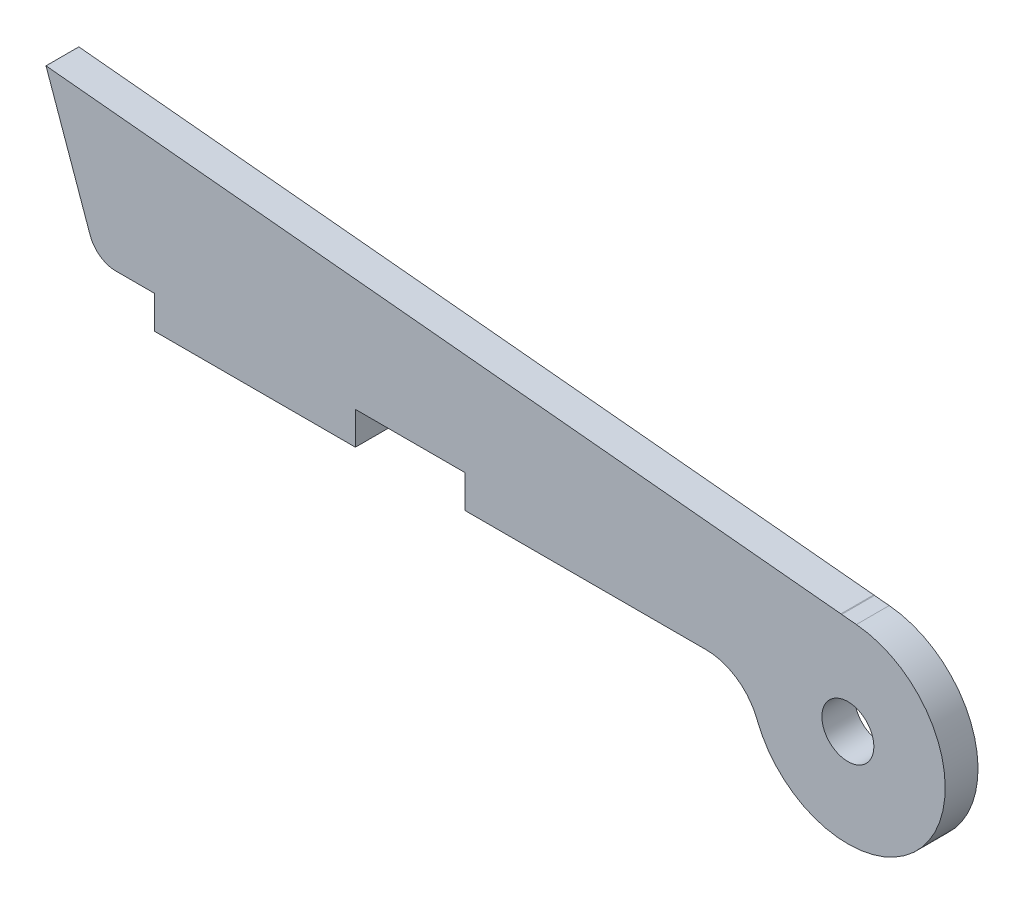
ISO-10303-21;
HEADER;
FILE_DESCRIPTION(('STEP AP214'),'2;1');
FILE_NAME('part.step','',(''),(''),'','','');
FILE_SCHEMA(('AUTOMOTIVE_DESIGN { 1 0 10303 214 1 1 1 1 }'));
ENDSEC;
DATA;
#1=APPLICATION_CONTEXT('core data for automotive mechanical design processes');
#2=APPLICATION_PROTOCOL_DEFINITION('international standard','automotive_design',2000,#1);
#3=PRODUCT_CONTEXT('',#1,'mechanical');
#4=PRODUCT('Part','Part','',(#3));
#5=PRODUCT_RELATED_PRODUCT_CATEGORY('part','',(#4));
#6=PRODUCT_DEFINITION_FORMATION('','',#4);
#7=PRODUCT_DEFINITION_CONTEXT('part definition',#1,'design');
#8=PRODUCT_DEFINITION('design','',#6,#7);
#9=PRODUCT_DEFINITION_SHAPE('','',#8);
#10=(LENGTH_UNIT() NAMED_UNIT(*) SI_UNIT(.MILLI.,.METRE.));
#11=(NAMED_UNIT(*) PLANE_ANGLE_UNIT() SI_UNIT($,.RADIAN.));
#12=(NAMED_UNIT(*) SI_UNIT($,.STERADIAN.) SOLID_ANGLE_UNIT());
#13=UNCERTAINTY_MEASURE_WITH_UNIT(LENGTH_MEASURE(1.E-05),#10,'distance_accuracy_value','');
#14=(GEOMETRIC_REPRESENTATION_CONTEXT(3) GLOBAL_UNCERTAINTY_ASSIGNED_CONTEXT((#13)) GLOBAL_UNIT_ASSIGNED_CONTEXT((#10,
#11,#12)) REPRESENTATION_CONTEXT('',''));
#15=CARTESIAN_POINT('',(0.,0.,0.));
#16=DIRECTION('',(0.,0.,1.));
#17=DIRECTION('',(1.,0.,0.));
#18=AXIS2_PLACEMENT_3D('',#15,#16,#17);
#19=CARTESIAN_POINT('',(2.00757191701242,-5.99999999999999,3.));
#20=DIRECTION('',(0.,1.,0.));
#21=DIRECTION('',(0.,0.,1.));
#22=AXIS2_PLACEMENT_3D('',#19,#20,#21);
#23=PLANE('',#22);
#24=DIRECTION('',(1.,0.,0.));
#25=VECTOR('',#24,1.);
#26=CARTESIAN_POINT('',(2.00757191701242,-5.99999999999999,3.));
#27=LINE('',#26,#25);
#28=CARTESIAN_POINT('',(31.983719277546,-5.99999999999999,3.));
#29=VERTEX_POINT('',#28);
#30=CARTESIAN_POINT('',(76.0687400906501,-5.99999999999999,3.));
#31=VERTEX_POINT('',#30);
#32=EDGE_CURVE('E207',#29,#31,#27,.T.);
#33=ORIENTED_EDGE('',*,*,#32,.F.);
#34=DIRECTION('',(0.,0.,-1.));
#35=VECTOR('',#34,1.);
#36=CARTESIAN_POINT('',(31.983719277546,-5.99999999999999,3.));
#37=LINE('',#36,#35);
#38=CARTESIAN_POINT('',(31.983719277546,-5.99999999999999,-3.));
#39=VERTEX_POINT('',#38);
#40=EDGE_CURVE('E161',#29,#39,#37,.T.);
#41=ORIENTED_EDGE('',*,*,#40,.T.);
#42=DIRECTION('',(1.,0.,0.));
#43=VECTOR('',#42,1.);
#44=CARTESIAN_POINT('',(2.00757191701242,-5.99999999999999,-3.));
#45=LINE('',#44,#43);
#46=CARTESIAN_POINT('',(76.0687400906501,-5.99999999999999,-3.));
#47=VERTEX_POINT('',#46);
#48=EDGE_CURVE('E215',#39,#47,#45,.T.);
#49=ORIENTED_EDGE('',*,*,#48,.T.);
#50=DIRECTION('',(0.,0.,1.));
#51=VECTOR('',#50,1.);
#52=CARTESIAN_POINT('',(76.0687400906501,-5.99999999999999,3.));
#53=LINE('',#52,#51);
#54=EDGE_CURVE('E231',#47,#31,#53,.T.);
#55=ORIENTED_EDGE('',*,*,#54,.T.);
#56=EDGE_LOOP('',(#33,#41,#49,#55));
#57=FACE_BOUND('',#56,.T.);
#58=ADVANCED_FACE('F41',(#57),#23,.F.);
#59=CARTESIAN_POINT('',(102.,-5.99999999999999,3.));
#60=DIRECTION('',(0.,0.,1.));
#61=DIRECTION('',(1.,0.,0.));
#62=AXIS2_PLACEMENT_3D('',#59,#60,#61);
#63=PLANE('',#62);
#64=DIRECTION('',(0.333806859233768,-0.942641491092179,0.));
#65=VECTOR('',#64,1.);
#66=CARTESIAN_POINT('',(-31.5838701951714,-10.5660149347445,3.));
#67=LINE('',#66,#65);
#68=CARTESIAN_POINT('',(-44.5690411468044,26.1029766373016,3.));
#69=VERTEX_POINT('',#68);
#70=CARTESIAN_POINT('',(-36.5050491413905,3.33096570383117,3.));
#71=VERTEX_POINT('',#70);
#72=EDGE_CURVE('E206',#69,#71,#67,.T.);
#73=ORIENTED_EDGE('',*,*,#72,.T.);
#74=CARTESIAN_POINT('',(-31.7918416859296,5.00000000000002,3.));
#75=DIRECTION('',(0.,0.,1.));
#76=DIRECTION('',(1.,0.,0.));
#77=AXIS2_PLACEMENT_3D('',#74,#75,#76);
#78=CIRCLE('',#77,5.);
#79=CARTESIAN_POINT('',(-31.7918416859296,0.,3.));
#80=VERTEX_POINT('',#79);
#81=EDGE_CURVE('E63',#71,#80,#78,.T.);
#82=ORIENTED_EDGE('',*,*,#81,.T.);
#83=DIRECTION('',(1.,0.,0.));
#84=VECTOR('',#83,1.);
#85=CARTESIAN_POINT('',(-24.75,0.,3.));
#86=LINE('',#85,#84);
#87=CARTESIAN_POINT('',(-24.75,0.,3.));
#88=VERTEX_POINT('',#87);
#89=EDGE_CURVE('E138',#80,#88,#86,.T.);
#90=ORIENTED_EDGE('',*,*,#89,.T.);
#91=DIRECTION('',(0.,-1.,0.));
#92=VECTOR('',#91,1.);
#93=CARTESIAN_POINT('',(-24.75,-5.99999999999999,3.));
#94=LINE('',#93,#92);
#95=CARTESIAN_POINT('',(-24.75,-5.99999999999999,3.));
#96=VERTEX_POINT('',#95);
#97=EDGE_CURVE('E144',#88,#96,#94,.T.);
#98=ORIENTED_EDGE('',*,*,#97,.T.);
#99=CARTESIAN_POINT('',(11.983719277546,-5.99999999999999,3.));
#100=VERTEX_POINT('',#99);
#101=EDGE_CURVE('E209',#96,#100,#27,.T.);
#102=ORIENTED_EDGE('',*,*,#101,.T.);
#103=DIRECTION('',(0.,1.,0.));
#104=VECTOR('',#103,1.);
#105=CARTESIAN_POINT('',(11.983719277546,-5.99999999999999,3.));
#106=LINE('',#105,#104);
#107=CARTESIAN_POINT('',(11.983719277546,0.,3.));
#108=VERTEX_POINT('',#107);
#109=EDGE_CURVE('E165',#100,#108,#106,.T.);
#110=ORIENTED_EDGE('',*,*,#109,.T.);
#111=DIRECTION('',(1.,0.,0.));
#112=VECTOR('',#111,1.);
#113=CARTESIAN_POINT('',(11.983719277546,0.,3.));
#114=LINE('',#113,#112);
#115=CARTESIAN_POINT('',(31.983719277546,0.,3.));
#116=VERTEX_POINT('',#115);
#117=EDGE_CURVE('E168',#108,#116,#114,.T.);
#118=ORIENTED_EDGE('',*,*,#117,.T.);
#119=DIRECTION('',(0.,-1.,0.));
#120=VECTOR('',#119,1.);
#121=CARTESIAN_POINT('',(31.983719277546,0.,3.));
#122=LINE('',#121,#120);
#123=EDGE_CURVE('E172',#116,#29,#122,.T.);
#124=ORIENTED_EDGE('',*,*,#123,.T.);
#125=ORIENTED_EDGE('',*,*,#32,.T.);
#126=CARTESIAN_POINT('',(76.0687400906501,-16.,3.));
#127=DIRECTION('',(0.,0.,1.));
#128=DIRECTION('',(1.,0.,0.));
#129=AXIS2_PLACEMENT_3D('',#126,#127,#128);
#130=CIRCLE('',#129,10.);
#131=CARTESIAN_POINT('',(85.3990052046383,-12.4019237219461,3.));
#132=VERTEX_POINT('',#131);
#133=EDGE_CURVE('E236',#31,#132,#130,.F.);
#134=ORIENTED_EDGE('',*,*,#133,.T.);
#135=CARTESIAN_POINT('',(102.,-5.99999999999999,3.));
#136=DIRECTION('',(0.,0.,1.));
#137=DIRECTION('',(1.,0.,0.));
#138=AXIS2_PLACEMENT_3D('',#135,#136,#137);
#139=CIRCLE('',#138,17.7926292474508);
#140=CARTESIAN_POINT('',(103.556935199325,11.7243789262796,3.));
#141=VERTEX_POINT('',#140);
#142=EDGE_CURVE('E197',#132,#141,#139,.T.);
#143=ORIENTED_EDGE('',*,*,#142,.T.);
#144=CARTESIAN_POINT('',(116.420097305262,158.160505140532,3.));
#145=DIRECTION('',(0.,0.,1.));
#146=DIRECTION('',(1.,0.,0.));
#147=AXIS2_PLACEMENT_3D('',#144,#145,#146);
#148=CIRCLE('',#147,147.);
#149=CARTESIAN_POINT('',(100.875322561309,11.9847206269545,3.));
#150=VERTEX_POINT('',#149);
#151=EDGE_CURVE('E229',#141,#150,#148,.F.);
#152=ORIENTED_EDGE('',*,*,#151,.T.);
#153=CARTESIAN_POINT('',(99.1363322533131,-4.36793013317752,3.));
#154=DIRECTION('',(0.,0.,1.));
#155=DIRECTION('',(1.,0.,0.));
#156=AXIS2_PLACEMENT_3D('',#153,#154,#155);
#157=CIRCLE('',#156,16.4448555534596);
#158=CARTESIAN_POINT('',(100.725085641845,12.,3.));
#159=VERTEX_POINT('',#158);
#160=EDGE_CURVE('E201',#150,#159,#157,.T.);
#161=ORIENTED_EDGE('',*,*,#160,.T.);
#162=DIRECTION('',(-0.995322219764594,0.0966109664731739,0.));
#163=VECTOR('',#162,1.);
#164=CARTESIAN_POINT('',(100.725085641845,12.,3.));
#165=LINE('',#164,#163);
#166=EDGE_CURVE('E203',#159,#69,#165,.T.);
#167=ORIENTED_EDGE('',*,*,#166,.T.);
#168=EDGE_LOOP('',(#73,#82,#90,#98,#102,#110,#118,#124,#125,#134,#143,#152,#161,#167));
#169=FACE_BOUND('',#168,.T.);
#170=CARTESIAN_POINT('',(102.,-5.99999999999999,3.));
#171=DIRECTION('',(0.,0.,1.));
#172=DIRECTION('',(1.,0.,0.));
#173=AXIS2_PLACEMENT_3D('',#170,#171,#172);
#174=CIRCLE('',#173,4.75);
#175=CARTESIAN_POINT('',(106.75,-5.99999999999999,3.));
#176=VERTEX_POINT('',#175);
#177=EDGE_CURVE('E163',#176,#176,#174,.T.);
#178=ORIENTED_EDGE('',*,*,#177,.F.);
#179=EDGE_LOOP('',(#178));
#180=FACE_BOUND('',#179,.T.);
#181=ADVANCED_FACE('F140',(#169,#180),#63,.T.);
#182=CARTESIAN_POINT('',(102.,-5.99999999999999,-3.));
#183=DIRECTION('',(0.,0.,1.));
#184=DIRECTION('',(1.,0.,0.));
#185=AXIS2_PLACEMENT_3D('',#182,#183,#184);
#186=PLANE('',#185);
#187=DIRECTION('',(1.,0.,0.));
#188=VECTOR('',#187,1.);
#189=CARTESIAN_POINT('',(-24.75,0.,-3.));
#190=LINE('',#189,#188);
#191=CARTESIAN_POINT('',(-31.7918416859296,0.,-3.));
#192=VERTEX_POINT('',#191);
#193=CARTESIAN_POINT('',(-24.75,0.,-3.));
#194=VERTEX_POINT('',#193);
#195=EDGE_CURVE('E151',#192,#194,#190,.T.);
#196=ORIENTED_EDGE('',*,*,#195,.F.);
#197=CARTESIAN_POINT('',(-31.7918416859296,5.00000000000002,-3.));
#198=DIRECTION('',(0.,0.,1.));
#199=DIRECTION('',(1.,0.,0.));
#200=AXIS2_PLACEMENT_3D('',#197,#198,#199);
#201=CIRCLE('',#200,5.);
#202=CARTESIAN_POINT('',(-36.5050491413905,3.33096570383117,-3.));
#203=VERTEX_POINT('',#202);
#204=EDGE_CURVE('E12',#192,#203,#201,.F.);
#205=ORIENTED_EDGE('',*,*,#204,.T.);
#206=DIRECTION('',(0.333806859233768,-0.942641491092179,0.));
#207=VECTOR('',#206,1.);
#208=CARTESIAN_POINT('',(-31.5838701951714,-10.5660149347445,-3.));
#209=LINE('',#208,#207);
#210=CARTESIAN_POINT('',(-44.5690411468044,26.1029766373016,-3.));
#211=VERTEX_POINT('',#210);
#212=EDGE_CURVE('E214',#211,#203,#209,.T.);
#213=ORIENTED_EDGE('',*,*,#212,.F.);
#214=DIRECTION('',(-0.995322219764594,0.0966109664731739,0.));
#215=VECTOR('',#214,1.);
#216=CARTESIAN_POINT('',(100.725085641845,12.,-3.));
#217=LINE('',#216,#215);
#218=CARTESIAN_POINT('',(100.725085641845,12.,-3.));
#219=VERTEX_POINT('',#218);
#220=EDGE_CURVE('E211',#219,#211,#217,.T.);
#221=ORIENTED_EDGE('',*,*,#220,.F.);
#222=CARTESIAN_POINT('',(99.1363322533131,-4.36793013317752,-3.));
#223=DIRECTION('',(0.,0.,1.));
#224=DIRECTION('',(1.,0.,0.));
#225=AXIS2_PLACEMENT_3D('',#222,#223,#224);
#226=CIRCLE('',#225,16.4448555534596);
#227=CARTESIAN_POINT('',(100.875322561309,11.9847206269545,-3.));
#228=VERTEX_POINT('',#227);
#229=EDGE_CURVE('E193',#228,#219,#226,.T.);
#230=ORIENTED_EDGE('',*,*,#229,.F.);
#231=CARTESIAN_POINT('',(116.420097305262,158.160505140532,-3.));
#232=DIRECTION('',(0.,0.,1.));
#233=DIRECTION('',(1.,0.,0.));
#234=AXIS2_PLACEMENT_3D('',#231,#232,#233);
#235=CIRCLE('',#234,147.);
#236=CARTESIAN_POINT('',(103.556935199325,11.7243789262796,-3.));
#237=VERTEX_POINT('',#236);
#238=EDGE_CURVE('E227',#228,#237,#235,.T.);
#239=ORIENTED_EDGE('',*,*,#238,.T.);
#240=CARTESIAN_POINT('',(102.,-5.99999999999999,-3.));
#241=DIRECTION('',(0.,0.,1.));
#242=DIRECTION('',(1.,0.,0.));
#243=AXIS2_PLACEMENT_3D('',#240,#241,#242);
#244=CIRCLE('',#243,17.7926292474508);
#245=CARTESIAN_POINT('',(85.3990052046383,-12.4019237219461,-3.));
#246=VERTEX_POINT('',#245);
#247=EDGE_CURVE('E190',#237,#246,#244,.F.);
#248=ORIENTED_EDGE('',*,*,#247,.T.);
#249=CARTESIAN_POINT('',(76.0687400906501,-16.,-3.));
#250=DIRECTION('',(0.,0.,1.));
#251=DIRECTION('',(1.,0.,0.));
#252=AXIS2_PLACEMENT_3D('',#249,#250,#251);
#253=CIRCLE('',#252,10.);
#254=EDGE_CURVE('E238',#246,#47,#253,.T.);
#255=ORIENTED_EDGE('',*,*,#254,.T.);
#256=ORIENTED_EDGE('',*,*,#48,.F.);
#257=DIRECTION('',(0.,-1.,0.));
#258=VECTOR('',#257,1.);
#259=CARTESIAN_POINT('',(31.983719277546,0.,-3.));
#260=LINE('',#259,#258);
#261=CARTESIAN_POINT('',(31.983719277546,0.,-3.));
#262=VERTEX_POINT('',#261);
#263=EDGE_CURVE('E169',#262,#39,#260,.T.);
#264=ORIENTED_EDGE('',*,*,#263,.F.);
#265=DIRECTION('',(1.,0.,0.));
#266=VECTOR('',#265,1.);
#267=CARTESIAN_POINT('',(11.983719277546,0.,-3.));
#268=LINE('',#267,#266);
#269=CARTESIAN_POINT('',(11.983719277546,0.,-3.));
#270=VERTEX_POINT('',#269);
#271=EDGE_CURVE('E179',#270,#262,#268,.T.);
#272=ORIENTED_EDGE('',*,*,#271,.F.);
#273=DIRECTION('',(0.,1.,0.));
#274=VECTOR('',#273,1.);
#275=CARTESIAN_POINT('',(11.983719277546,-5.99999999999999,-3.));
#276=LINE('',#275,#274);
#277=CARTESIAN_POINT('',(11.983719277546,-5.99999999999999,-3.));
#278=VERTEX_POINT('',#277);
#279=EDGE_CURVE('E176',#278,#270,#276,.T.);
#280=ORIENTED_EDGE('',*,*,#279,.F.);
#281=CARTESIAN_POINT('',(-24.75,-5.99999999999999,-3.));
#282=VERTEX_POINT('',#281);
#283=EDGE_CURVE('E204',#282,#278,#45,.T.);
#284=ORIENTED_EDGE('',*,*,#283,.F.);
#285=DIRECTION('',(0.,-1.,0.));
#286=VECTOR('',#285,1.);
#287=CARTESIAN_POINT('',(-24.75,-5.99999999999999,-3.));
#288=LINE('',#287,#286);
#289=EDGE_CURVE('E146',#194,#282,#288,.T.);
#290=ORIENTED_EDGE('',*,*,#289,.F.);
#291=EDGE_LOOP('',(#196,#205,#213,#221,#230,#239,#248,#255,#256,#264,#272,#280,#284,#290));
#292=FACE_BOUND('',#291,.T.);
#293=CARTESIAN_POINT('',(102.,-5.99999999999999,-3.));
#294=DIRECTION('',(0.,0.,1.));
#295=DIRECTION('',(1.,0.,0.));
#296=AXIS2_PLACEMENT_3D('',#293,#294,#295);
#297=CIRCLE('',#296,4.75);
#298=CARTESIAN_POINT('',(106.75,-5.99999999999999,-3.00000000000001));
#299=VERTEX_POINT('',#298);
#300=EDGE_CURVE('E194',#299,#299,#297,.F.);
#301=ORIENTED_EDGE('',*,*,#300,.F.);
#302=EDGE_LOOP('',(#301));
#303=FACE_BOUND('',#302,.T.);
#304=ADVANCED_FACE('F264',(#292,#303),#186,.F.);
#305=CARTESIAN_POINT('',(99.1363322533131,-4.36793013317752,3.));
#306=DIRECTION('',(0.,0.,-1.));
#307=DIRECTION('',(-1.,0.,0.));
#308=AXIS2_PLACEMENT_3D('',#305,#306,#307);
#309=CYLINDRICAL_SURFACE('',#308,16.4448555534596);
#310=ORIENTED_EDGE('',*,*,#160,.F.);
#311=DIRECTION('',(0.,0.,-1.));
#312=VECTOR('',#311,1.);
#313=CARTESIAN_POINT('',(100.875322561309,11.9847206269546,3.));
#314=LINE('',#313,#312);
#315=EDGE_CURVE('E220',#150,#228,#314,.T.);
#316=ORIENTED_EDGE('',*,*,#315,.T.);
#317=ORIENTED_EDGE('',*,*,#229,.T.);
#318=DIRECTION('',(0.,0.,-1.));
#319=VECTOR('',#318,1.);
#320=CARTESIAN_POINT('',(100.725085641845,12.,3.));
#321=LINE('',#320,#319);
#322=EDGE_CURVE('E217',#159,#219,#321,.T.);
#323=ORIENTED_EDGE('',*,*,#322,.F.);
#324=EDGE_LOOP('',(#310,#316,#317,#323));
#325=FACE_BOUND('',#324,.T.);
#326=ADVANCED_FACE('F324',(#325),#309,.T.);
#327=CARTESIAN_POINT('',(100.725085641845,12.,3.));
#328=DIRECTION('',(-0.0966109664731739,-0.995322219764594,0.));
#329=DIRECTION('',(0.995322219764594,-0.0966109664731739,0.));
#330=AXIS2_PLACEMENT_3D('',#327,#328,#329);
#331=PLANE('',#330);
#332=ORIENTED_EDGE('',*,*,#220,.T.);
#333=DIRECTION('',(0.,0.,-1.));
#334=VECTOR('',#333,1.);
#335=CARTESIAN_POINT('',(-44.5690411468044,26.1029766373016,3.));
#336=LINE('',#335,#334);
#337=EDGE_CURVE('E221',#69,#211,#336,.T.);
#338=ORIENTED_EDGE('',*,*,#337,.F.);
#339=ORIENTED_EDGE('',*,*,#166,.F.);
#340=ORIENTED_EDGE('',*,*,#322,.T.);
#341=EDGE_LOOP('',(#332,#338,#339,#340));
#342=FACE_BOUND('',#341,.T.);
#343=ADVANCED_FACE('F260',(#342),#331,.F.);
#344=CARTESIAN_POINT('',(-31.5838701951714,-10.5660149347445,3.));
#345=DIRECTION('',(0.942641491092179,0.333806859233768,0.));
#346=DIRECTION('',(-0.333806859233768,0.942641491092179,0.));
#347=AXIS2_PLACEMENT_3D('',#344,#345,#346);
#348=PLANE('',#347);
#349=ORIENTED_EDGE('',*,*,#212,.T.);
#350=DIRECTION('',(0.,0.,1.));
#351=VECTOR('',#350,1.);
#352=CARTESIAN_POINT('',(-36.5050491413905,3.33096570383117,3.));
#353=LINE('',#352,#351);
#354=EDGE_CURVE('E241',#203,#71,#353,.T.);
#355=ORIENTED_EDGE('',*,*,#354,.T.);
#356=ORIENTED_EDGE('',*,*,#72,.F.);
#357=ORIENTED_EDGE('',*,*,#337,.T.);
#358=EDGE_LOOP('',(#349,#355,#356,#357));
#359=FACE_BOUND('',#358,.T.);
#360=ADVANCED_FACE('F252',(#359),#348,.F.);
#361=ORIENTED_EDGE('',*,*,#101,.F.);
#362=DIRECTION('',(0.,0.,-1.));
#363=VECTOR('',#362,1.);
#364=CARTESIAN_POINT('',(-24.75,-5.99999999999999,3.));
#365=LINE('',#364,#363);
#366=EDGE_CURVE('E154',#96,#282,#365,.T.);
#367=ORIENTED_EDGE('',*,*,#366,.T.);
#368=ORIENTED_EDGE('',*,*,#283,.T.);
#369=DIRECTION('',(0.,0.,-1.));
#370=VECTOR('',#369,1.);
#371=CARTESIAN_POINT('',(11.983719277546,-5.99999999999999,3.));
#372=LINE('',#371,#370);
#373=EDGE_CURVE('E175',#100,#278,#372,.T.);
#374=ORIENTED_EDGE('',*,*,#373,.F.);
#375=EDGE_LOOP('',(#361,#367,#368,#374));
#376=FACE_BOUND('',#375,.T.);
#377=ADVANCED_FACE('F274',(#376),#23,.F.);
#378=CARTESIAN_POINT('',(102.,-5.99999999999999,-53.3251551840422));
#379=DIRECTION('',(0.,0.,1.));
#380=DIRECTION('',(1.,0.,0.));
#381=AXIS2_PLACEMENT_3D('',#378,#379,#380);
#382=CYLINDRICAL_SURFACE('',#381,4.75);
#383=CARTESIAN_POINT('',(106.75,-5.99999999999999,-3.00000000000001));
#384=CARTESIAN_POINT('',(106.75,-5.99999999999999,-2.93750000000001));
#385=CARTESIAN_POINT('',(106.75,-5.99999999999999,-2.87500000000001));
#386=CARTESIAN_POINT('',(106.75,-5.99999999999999,-2.75000000000001));
#387=CARTESIAN_POINT('',(106.75,-5.99999999999999,-2.68750000000001));
#388=CARTESIAN_POINT('',(106.75,-5.99999999999999,-2.56250000000001));
#389=CARTESIAN_POINT('',(106.75,-5.99999999999999,-2.50000000000001));
#390=CARTESIAN_POINT('',(106.75,-5.99999999999999,-2.37500000000001));
#391=CARTESIAN_POINT('',(106.75,-5.99999999999999,-2.31250000000001));
#392=CARTESIAN_POINT('',(106.75,-5.99999999999999,-2.18750000000001));
#393=CARTESIAN_POINT('',(106.75,-5.99999999999999,-2.12500000000001));
#394=CARTESIAN_POINT('',(106.75,-5.99999999999999,-2.00000000000001));
#395=CARTESIAN_POINT('',(106.75,-5.99999999999999,-1.93750000000001));
#396=CARTESIAN_POINT('',(106.75,-5.99999999999999,-1.81250000000001));
#397=CARTESIAN_POINT('',(106.75,-5.99999999999999,-1.75000000000001));
#398=CARTESIAN_POINT('',(106.75,-5.99999999999999,-1.62500000000001));
#399=CARTESIAN_POINT('',(106.75,-5.99999999999999,-1.56250000000001));
#400=CARTESIAN_POINT('',(106.75,-5.99999999999999,-1.43750000000001));
#401=CARTESIAN_POINT('',(106.75,-5.99999999999999,-1.37500000000001));
#402=CARTESIAN_POINT('',(106.75,-5.99999999999999,-1.25000000000001));
#403=CARTESIAN_POINT('',(106.75,-5.99999999999999,-1.18750000000001));
#404=CARTESIAN_POINT('',(106.75,-5.99999999999999,-1.06250000000001));
#405=CARTESIAN_POINT('',(106.75,-5.99999999999999,-1.00000000000001));
#406=CARTESIAN_POINT('',(106.75,-5.99999999999999,-0.875000000000008));
#407=CARTESIAN_POINT('',(106.75,-5.99999999999999,-0.812500000000008));
#408=CARTESIAN_POINT('',(106.75,-5.99999999999999,-0.687500000000008));
#409=CARTESIAN_POINT('',(106.75,-5.99999999999999,-0.625000000000008));
#410=CARTESIAN_POINT('',(106.75,-5.99999999999999,-0.500000000000007));
#411=CARTESIAN_POINT('',(106.75,-5.99999999999999,-0.437500000000007));
#412=CARTESIAN_POINT('',(106.75,-5.99999999999999,-0.312500000000007));
#413=CARTESIAN_POINT('',(106.75,-5.99999999999999,-0.250000000000007));
#414=CARTESIAN_POINT('',(106.75,-5.99999999999999,-0.125000000000007));
#415=CARTESIAN_POINT('',(106.75,-5.99999999999999,-0.062500000000007));
#416=CARTESIAN_POINT('',(106.75,-5.99999999999999,0.0624999999999931));
#417=CARTESIAN_POINT('',(106.75,-5.99999999999999,0.124999999999993));
#418=CARTESIAN_POINT('',(106.75,-5.99999999999999,0.249999999999993));
#419=CARTESIAN_POINT('',(106.75,-5.99999999999999,0.312499999999993));
#420=CARTESIAN_POINT('',(106.75,-5.99999999999999,0.437499999999993));
#421=CARTESIAN_POINT('',(106.75,-5.99999999999999,0.499999999999994));
#422=CARTESIAN_POINT('',(106.75,-5.99999999999999,0.624999999999994));
#423=CARTESIAN_POINT('',(106.75,-5.99999999999999,0.687499999999994));
#424=CARTESIAN_POINT('',(106.75,-5.99999999999999,0.812499999999994));
#425=CARTESIAN_POINT('',(106.75,-5.99999999999999,0.874999999999994));
#426=CARTESIAN_POINT('',(106.75,-5.99999999999999,0.999999999999994));
#427=CARTESIAN_POINT('',(106.75,-5.99999999999999,1.06249999999999));
#428=CARTESIAN_POINT('',(106.75,-5.99999999999999,1.18749999999999));
#429=CARTESIAN_POINT('',(106.75,-5.99999999999999,1.24999999999999));
#430=CARTESIAN_POINT('',(106.75,-5.99999999999999,1.37499999999999));
#431=CARTESIAN_POINT('',(106.75,-5.99999999999999,1.43749999999999));
#432=CARTESIAN_POINT('',(106.75,-5.99999999999999,1.56249999999999));
#433=CARTESIAN_POINT('',(106.75,-5.99999999999999,1.62499999999999));
#434=CARTESIAN_POINT('',(106.75,-5.99999999999999,1.74999999999999));
#435=CARTESIAN_POINT('',(106.75,-5.99999999999999,1.81249999999999));
#436=CARTESIAN_POINT('',(106.75,-5.99999999999999,1.93749999999999));
#437=CARTESIAN_POINT('',(106.75,-5.99999999999999,1.99999999999999));
#438=CARTESIAN_POINT('',(106.75,-5.99999999999999,2.125));
#439=CARTESIAN_POINT('',(106.75,-5.99999999999999,2.1875));
#440=CARTESIAN_POINT('',(106.75,-5.99999999999999,2.3125));
#441=CARTESIAN_POINT('',(106.75,-5.99999999999999,2.375));
#442=CARTESIAN_POINT('',(106.75,-5.99999999999999,2.5));
#443=CARTESIAN_POINT('',(106.75,-5.99999999999999,2.5625));
#444=CARTESIAN_POINT('',(106.75,-5.99999999999999,2.6875));
#445=CARTESIAN_POINT('',(106.75,-5.99999999999999,2.75));
#446=CARTESIAN_POINT('',(106.75,-5.99999999999999,2.875));
#447=CARTESIAN_POINT('',(106.75,-5.99999999999999,2.9375));
#448=CARTESIAN_POINT('',(106.75,-5.99999999999999,3.));
#449=B_SPLINE_CURVE_WITH_KNOTS('',3,(#383,#384,#385,#386,#387,#388,#389,#390,#391,#392,#393,
#394,#395,#396,#397,#398,#399,#400,#401,#402,#403,#404,#405,#406,#407,#408,#409,#410,#411,#412,
#413,#414,#415,#416,#417,#418,#419,#420,#421,#422,#423,#424,#425,#426,#427,#428,#429,#430,#431,
#432,#433,#434,#435,#436,#437,#438,#439,#440,#441,#442,#443,#444,#445,#446,#447,#448),
.UNSPECIFIED.,.F.,.F.,(4,2,2,2,2,2,2,2,2,2,2,2,2,2,2,2,2,2,2,2,2,2,2,2,2,2,2,2,2,2,2,2,4),(0.,
0.1875,0.375,0.5625,0.750000000000001,0.937500000000001,1.125,1.3125,1.5,1.6875,1.875,2.0625,
2.25,2.4375,2.625,2.8125,3.,3.1875,3.375,3.5625,3.75,3.9375,4.125,4.3125,4.5,4.6875,4.875,
5.0625,5.25,5.4375,5.62500000000001,5.81250000000001,6.00000000000001),.UNSPECIFIED.);
#450=EDGE_CURVE('BSEAM284',#299,#176,#449,.T.);
#451=ORIENTED_EDGE('',*,*,#300,.T.);
#452=ORIENTED_EDGE('',*,*,#177,.T.);
#453=ORIENTED_EDGE('',*,*,#450,.T.);
#454=ORIENTED_EDGE('',*,*,#450,.F.);
#455=EDGE_LOOP('',(#451,#453,#452,#454));
#456=FACE_BOUND('',#455,.T.);
#457=ADVANCED_FACE('F284',(#456),#382,.F.);
#458=CARTESIAN_POINT('',(102.,-5.99999999999999,-53.3251551840422));
#459=DIRECTION('',(0.,0.,1.));
#460=DIRECTION('',(1.,0.,0.));
#461=AXIS2_PLACEMENT_3D('',#458,#459,#460);
#462=CYLINDRICAL_SURFACE('',#461,17.7926292474508);
#463=ORIENTED_EDGE('',*,*,#142,.F.);
#464=DIRECTION('',(0.,0.,1.));
#465=VECTOR('',#464,1.);
#466=CARTESIAN_POINT('',(85.3990052046383,-12.4019237219461,-53.3251551840422));
#467=LINE('',#466,#465);
#468=EDGE_CURVE('E234',#132,#246,#467,.F.);
#469=ORIENTED_EDGE('',*,*,#468,.T.);
#470=ORIENTED_EDGE('',*,*,#247,.F.);
#471=DIRECTION('',(0.,0.,1.));
#472=VECTOR('',#471,1.);
#473=CARTESIAN_POINT('',(103.556935199325,11.7243789262796,-53.3251551840422));
#474=LINE('',#473,#472);
#475=EDGE_CURVE('E224',#237,#141,#474,.T.);
#476=ORIENTED_EDGE('',*,*,#475,.T.);
#477=EDGE_LOOP('',(#463,#469,#470,#476));
#478=FACE_BOUND('',#477,.T.);
#479=ADVANCED_FACE('F290',(#478),#462,.T.);
#480=CARTESIAN_POINT('',(116.420097305262,158.160505140532,-53.3251551840419));
#481=DIRECTION('',(0.,0.,1.));
#482=DIRECTION('',(1.,0.,0.));
#483=AXIS2_PLACEMENT_3D('',#480,#481,#482);
#484=CYLINDRICAL_SURFACE('',#483,147.);
#485=ORIENTED_EDGE('',*,*,#151,.F.);
#486=ORIENTED_EDGE('',*,*,#475,.F.);
#487=ORIENTED_EDGE('',*,*,#238,.F.);
#488=ORIENTED_EDGE('',*,*,#315,.F.);
#489=EDGE_LOOP('',(#485,#486,#487,#488));
#490=FACE_BOUND('',#489,.T.);
#491=ADVANCED_FACE('F322',(#490),#484,.F.);
#492=CARTESIAN_POINT('',(76.0687400906501,-16.,-53.3251551840422));
#493=DIRECTION('',(0.,0.,1.));
#494=DIRECTION('',(1.,0.,0.));
#495=AXIS2_PLACEMENT_3D('',#492,#493,#494);
#496=CYLINDRICAL_SURFACE('',#495,10.);
#497=ORIENTED_EDGE('',*,*,#254,.F.);
#498=ORIENTED_EDGE('',*,*,#468,.F.);
#499=ORIENTED_EDGE('',*,*,#133,.F.);
#500=ORIENTED_EDGE('',*,*,#54,.F.);
#501=EDGE_LOOP('',(#497,#498,#499,#500));
#502=FACE_BOUND('',#501,.T.);
#503=ADVANCED_FACE('F313',(#502),#496,.F.);
#504=CARTESIAN_POINT('',(31.983719277546,0.,3.));
#505=DIRECTION('',(1.,0.,0.));
#506=DIRECTION('',(0.,0.,-1.));
#507=AXIS2_PLACEMENT_3D('',#504,#505,#506);
#508=PLANE('',#507);
#509=ORIENTED_EDGE('',*,*,#263,.T.);
#510=ORIENTED_EDGE('',*,*,#40,.F.);
#511=ORIENTED_EDGE('',*,*,#123,.F.);
#512=DIRECTION('',(0.,0.,-1.));
#513=VECTOR('',#512,1.);
#514=CARTESIAN_POINT('',(31.983719277546,0.,3.));
#515=LINE('',#514,#513);
#516=EDGE_CURVE('E185',#116,#262,#515,.T.);
#517=ORIENTED_EDGE('',*,*,#516,.T.);
#518=EDGE_LOOP('',(#509,#510,#511,#517));
#519=FACE_BOUND('',#518,.T.);
#520=ADVANCED_FACE('F307',(#519),#508,.F.);
#521=CARTESIAN_POINT('',(11.983719277546,0.,3.));
#522=DIRECTION('',(0.,1.,0.));
#523=DIRECTION('',(-1.,0.,0.));
#524=AXIS2_PLACEMENT_3D('',#521,#522,#523);
#525=PLANE('',#524);
#526=ORIENTED_EDGE('',*,*,#271,.T.);
#527=ORIENTED_EDGE('',*,*,#516,.F.);
#528=ORIENTED_EDGE('',*,*,#117,.F.);
#529=DIRECTION('',(0.,0.,-1.));
#530=VECTOR('',#529,1.);
#531=CARTESIAN_POINT('',(11.983719277546,0.,3.));
#532=LINE('',#531,#530);
#533=EDGE_CURVE('E187',#108,#270,#532,.T.);
#534=ORIENTED_EDGE('',*,*,#533,.T.);
#535=EDGE_LOOP('',(#526,#527,#528,#534));
#536=FACE_BOUND('',#535,.T.);
#537=ADVANCED_FACE('F303',(#536),#525,.F.);
#538=CARTESIAN_POINT('',(11.983719277546,-5.99999999999999,3.));
#539=DIRECTION('',(-1.,0.,0.));
#540=DIRECTION('',(0.,0.,1.));
#541=AXIS2_PLACEMENT_3D('',#538,#539,#540);
#542=PLANE('',#541);
#543=ORIENTED_EDGE('',*,*,#279,.T.);
#544=ORIENTED_EDGE('',*,*,#533,.F.);
#545=ORIENTED_EDGE('',*,*,#109,.F.);
#546=ORIENTED_EDGE('',*,*,#373,.T.);
#547=EDGE_LOOP('',(#543,#544,#545,#546));
#548=FACE_BOUND('',#547,.T.);
#549=ADVANCED_FACE('F299',(#548),#542,.F.);
#550=CARTESIAN_POINT('',(-24.75,0.,3.));
#551=DIRECTION('',(0.,1.,0.));
#552=DIRECTION('',(-1.,0.,0.));
#553=AXIS2_PLACEMENT_3D('',#550,#551,#552);
#554=PLANE('',#553);
#555=ORIENTED_EDGE('',*,*,#89,.F.);
#556=DIRECTION('',(0.,0.,1.));
#557=VECTOR('',#556,1.);
#558=CARTESIAN_POINT('',(-31.7918416859296,0.,3.));
#559=LINE('',#558,#557);
#560=EDGE_CURVE('E49',#80,#192,#559,.F.);
#561=ORIENTED_EDGE('',*,*,#560,.T.);
#562=ORIENTED_EDGE('',*,*,#195,.T.);
#563=DIRECTION('',(0.,0.,-1.));
#564=VECTOR('',#563,1.);
#565=CARTESIAN_POINT('',(-24.75,0.,3.));
#566=LINE('',#565,#564);
#567=EDGE_CURVE('E149',#88,#194,#566,.T.);
#568=ORIENTED_EDGE('',*,*,#567,.F.);
#569=EDGE_LOOP('',(#555,#561,#562,#568));
#570=FACE_BOUND('',#569,.T.);
#571=ADVANCED_FACE('F150',(#570),#554,.F.);
#572=CARTESIAN_POINT('',(-24.75,-5.99999999999999,3.));
#573=DIRECTION('',(1.,0.,0.));
#574=DIRECTION('',(0.,1.,0.));
#575=AXIS2_PLACEMENT_3D('',#572,#573,#574);
#576=PLANE('',#575);
#577=ORIENTED_EDGE('',*,*,#289,.T.);
#578=ORIENTED_EDGE('',*,*,#366,.F.);
#579=ORIENTED_EDGE('',*,*,#97,.F.);
#580=ORIENTED_EDGE('',*,*,#567,.T.);
#581=EDGE_LOOP('',(#577,#578,#579,#580));
#582=FACE_BOUND('',#581,.T.);
#583=ADVANCED_FACE('F156',(#582),#576,.F.);
#584=CARTESIAN_POINT('',(-31.7918416859296,5.00000000000002,3.));
#585=DIRECTION('',(0.,0.,1.));
#586=DIRECTION('',(1.,0.,0.));
#587=AXIS2_PLACEMENT_3D('',#584,#585,#586);
#588=CYLINDRICAL_SURFACE('',#587,5.);
#589=ORIENTED_EDGE('',*,*,#204,.F.);
#590=ORIENTED_EDGE('',*,*,#560,.F.);
#591=ORIENTED_EDGE('',*,*,#81,.F.);
#592=ORIENTED_EDGE('',*,*,#354,.F.);
#593=EDGE_LOOP('',(#589,#590,#591,#592));
#594=FACE_BOUND('',#593,.T.);
#595=ADVANCED_FACE('F43',(#594),#588,.T.);
#596=CLOSED_SHELL('',(#58,#181,#304,#326,#343,#360,#377,#457,#479,#491,#503,#520,#537,#549,#571,
#583,#595));
#597=MANIFOLD_SOLID_BREP('B2',#596);
#598=ADVANCED_BREP_SHAPE_REPRESENTATION('',(#18,#597),#14);
#599=SHAPE_DEFINITION_REPRESENTATION(#9,#598);
ENDSEC;
END-ISO-10303-21;
